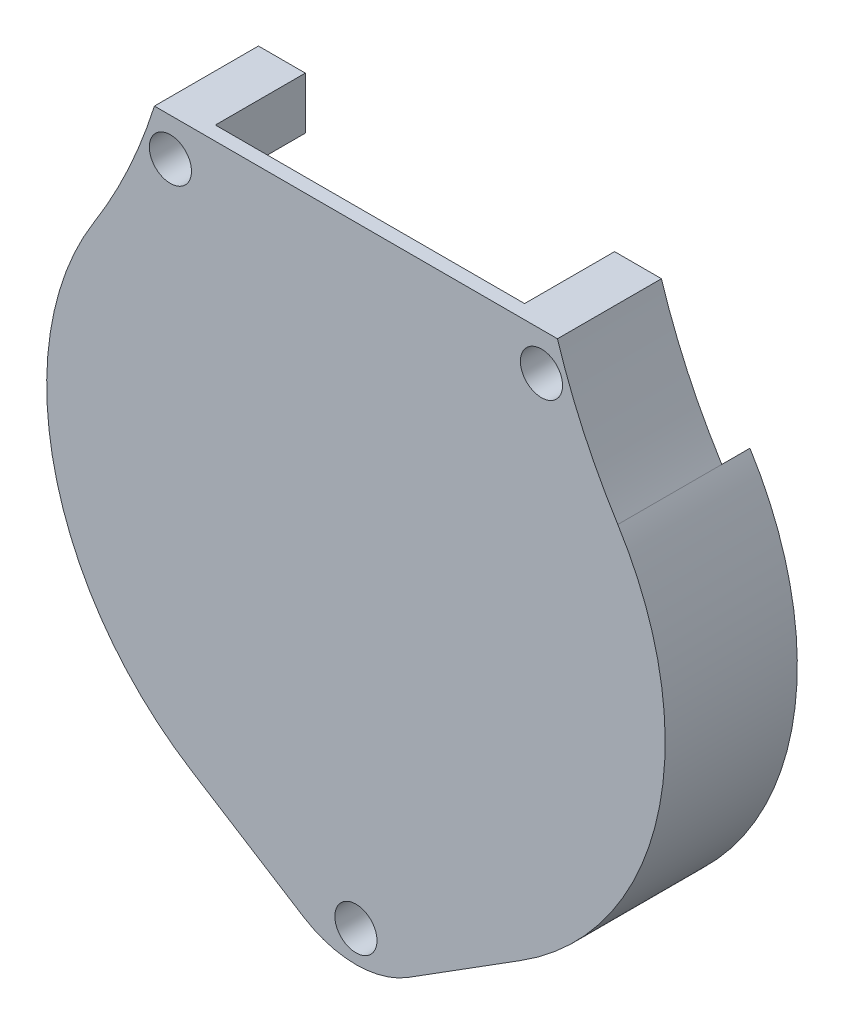
ISO-10303-21;
HEADER;
FILE_DESCRIPTION(('STEP AP214'),'2;1');
FILE_NAME('part.step','',(''),(''),'','','');
FILE_SCHEMA(('AUTOMOTIVE_DESIGN { 1 0 10303 214 1 1 1 1 }'));
ENDSEC;
DATA;
#1=APPLICATION_CONTEXT('core data for automotive mechanical design processes');
#2=APPLICATION_PROTOCOL_DEFINITION('international standard','automotive_design',2000,#1);
#3=PRODUCT_CONTEXT('',#1,'mechanical');
#4=PRODUCT('Part','Part','',(#3));
#5=PRODUCT_RELATED_PRODUCT_CATEGORY('part','',(#4));
#6=PRODUCT_DEFINITION_FORMATION('','',#4);
#7=PRODUCT_DEFINITION_CONTEXT('part definition',#1,'design');
#8=PRODUCT_DEFINITION('design','',#6,#7);
#9=PRODUCT_DEFINITION_SHAPE('','',#8);
#10=(LENGTH_UNIT() NAMED_UNIT(*) SI_UNIT(.MILLI.,.METRE.));
#11=(NAMED_UNIT(*) PLANE_ANGLE_UNIT() SI_UNIT($,.RADIAN.));
#12=(NAMED_UNIT(*) SI_UNIT($,.STERADIAN.) SOLID_ANGLE_UNIT());
#13=UNCERTAINTY_MEASURE_WITH_UNIT(LENGTH_MEASURE(1.E-05),#10,'distance_accuracy_value','');
#14=(GEOMETRIC_REPRESENTATION_CONTEXT(3) GLOBAL_UNCERTAINTY_ASSIGNED_CONTEXT((#13)) GLOBAL_UNIT_ASSIGNED_CONTEXT((#10,
#11,#12)) REPRESENTATION_CONTEXT('',''));
#15=CARTESIAN_POINT('',(0.,0.,0.));
#16=DIRECTION('',(0.,0.,1.));
#17=DIRECTION('',(1.,0.,0.));
#18=AXIS2_PLACEMENT_3D('',#15,#16,#17);
#19=CARTESIAN_POINT('',(0.,-22.5136363636364,0.));
#20=DIRECTION('',(0.,0.,-1.));
#21=DIRECTION('',(-1.,0.,0.));
#22=AXIS2_PLACEMENT_3D('',#19,#20,#21);
#23=PLANE('',#22);
#24=DIRECTION('',(-0.388341695242071,0.921515451707954,0.));
#25=VECTOR('',#24,1.);
#26=CARTESIAN_POINT('',(-23.6588709677419,14.8627529257449,0.));
#27=LINE('',#26,#25);
#28=CARTESIAN_POINT('',(-4.73782513208845,-30.035944055944,0.));
#29=VERTEX_POINT('',#28);
#30=CARTESIAN_POINT('',(-6.80534009565298,-25.1298342848197,0.));
#31=VERTEX_POINT('',#30);
#32=EDGE_CURVE('E189',#29,#31,#27,.T.);
#33=ORIENTED_EDGE('',*,*,#32,.F.);
#34=DIRECTION('',(0.846153846153846,-0.532938710021193,0.));
#35=VECTOR('',#34,1.);
#36=CARTESIAN_POINT('',(-4.73782513208844,-30.035944055944,0.));
#37=LINE('',#36,#35);
#38=CARTESIAN_POINT('',(-14.8903075579921,-23.6415384615385,0.));
#39=VERTEX_POINT('',#38);
#40=EDGE_CURVE('E340',#39,#29,#37,.T.);
#41=ORIENTED_EDGE('',*,*,#40,.F.);
#42=CARTESIAN_POINT('',(0.,0.,0.));
#43=DIRECTION('',(0.,0.,1.));
#44=DIRECTION('',(1.,0.,0.));
#45=AXIS2_PLACEMENT_3D('',#42,#43,#44);
#46=CIRCLE('',#45,27.94);
#47=CARTESIAN_POINT('',(-23.6588709677419,14.8627529257449,0.));
#48=VERTEX_POINT('',#47);
#49=EDGE_CURVE('E356',#48,#39,#46,.T.);
#50=ORIENTED_EDGE('',*,*,#49,.F.);
#51=CARTESIAN_POINT('',(-22.7387926966757,12.6794531308574,0.));
#52=VERTEX_POINT('',#51);
#53=EDGE_CURVE('E253',#52,#48,#27,.T.);
#54=ORIENTED_EDGE('',*,*,#53,.F.);
#55=CARTESIAN_POINT('',(0.,0.,0.));
#56=DIRECTION('',(0.,0.,-1.));
#57=DIRECTION('',(-1.,0.,0.));
#58=AXIS2_PLACEMENT_3D('',#55,#56,#57);
#59=CIRCLE('',#58,26.035);
#60=EDGE_CURVE('E321',#31,#52,#59,.T.);
#61=ORIENTED_EDGE('',*,*,#60,.F.);
#62=EDGE_LOOP('',(#33,#41,#50,#54,#61));
#63=FACE_BOUND('',#62,.T.);
#64=ADVANCED_FACE('F33',(#63),#23,.T.);
#65=CARTESIAN_POINT('',(11.7335904138503,23.241,11.43));
#66=DIRECTION('',(0.,1.,0.));
#67=DIRECTION('',(0.,0.,1.));
#68=AXIS2_PLACEMENT_3D('',#65,#66,#67);
#69=PLANE('',#68);
#70=DIRECTION('',(-1.,0.,0.));
#71=VECTOR('',#70,1.);
#72=CARTESIAN_POINT('',(11.7335904138503,23.241,10.668));
#73=LINE('',#72,#71);
#74=CARTESIAN_POINT('',(11.7335904138503,23.241,10.668));
#75=VERTEX_POINT('',#74);
#76=CARTESIAN_POINT('',(-11.7335904138503,23.241,10.668));
#77=VERTEX_POINT('',#76);
#78=EDGE_CURVE('E217',#75,#77,#73,.T.);
#79=ORIENTED_EDGE('',*,*,#78,.F.);
#80=DIRECTION('',(0.,0.,-1.));
#81=VECTOR('',#80,1.);
#82=CARTESIAN_POINT('',(11.7335904138503,23.241,11.43));
#83=LINE('',#82,#81);
#84=CARTESIAN_POINT('',(11.7335904138503,23.241,11.43));
#85=VERTEX_POINT('',#84);
#86=EDGE_CURVE('E331',#85,#75,#83,.T.);
#87=ORIENTED_EDGE('',*,*,#86,.F.);
#88=DIRECTION('',(1.,0.,0.));
#89=VECTOR('',#88,1.);
#90=CARTESIAN_POINT('',(11.7335904138503,23.241,11.43));
#91=LINE('',#90,#89);
#92=CARTESIAN_POINT('',(-11.7335904138503,23.241,11.43));
#93=VERTEX_POINT('',#92);
#94=EDGE_CURVE('E325',#93,#85,#91,.T.);
#95=ORIENTED_EDGE('',*,*,#94,.F.);
#96=DIRECTION('',(0.,0.,-1.));
#97=VECTOR('',#96,1.);
#98=CARTESIAN_POINT('',(-11.7335904138503,23.241,11.43));
#99=LINE('',#98,#97);
#100=EDGE_CURVE('E328',#93,#77,#99,.T.);
#101=ORIENTED_EDGE('',*,*,#100,.T.);
#102=EDGE_LOOP('',(#79,#87,#95,#101));
#103=FACE_BOUND('',#102,.T.);
#104=ADVANCED_FACE('F418',(#103),#69,.F.);
#105=CARTESIAN_POINT('',(0.,-22.5136363636364,11.938));
#106=DIRECTION('',(0.,0.,-1.));
#107=DIRECTION('',(-1.,0.,0.));
#108=AXIS2_PLACEMENT_3D('',#105,#106,#107);
#109=CYLINDRICAL_SURFACE('',#108,8.89);
#110=DIRECTION('',(0.,0.,-1.));
#111=VECTOR('',#110,1.);
#112=CARTESIAN_POINT('',(-4.73782513208844,-30.035944055944,11.938));
#113=LINE('',#112,#111);
#114=CARTESIAN_POINT('',(-4.73782513208844,-30.035944055944,11.938));
#115=VERTEX_POINT('',#114);
#116=CARTESIAN_POINT('',(-4.73782513208845,-30.035944055944,2.54));
#117=VERTEX_POINT('',#116);
#118=EDGE_CURVE('E353',#115,#117,#113,.T.);
#119=ORIENTED_EDGE('',*,*,#118,.T.);
#120=CARTESIAN_POINT('',(0.,-22.5136363636364,2.54));
#121=DIRECTION('',(0.,0.,-1.));
#122=DIRECTION('',(1.,0.,0.));
#123=AXIS2_PLACEMENT_3D('',#120,#121,#122);
#124=CIRCLE('',#123,8.89);
#125=CARTESIAN_POINT('',(4.73782513208845,-30.035944055944,2.54));
#126=VERTEX_POINT('',#125);
#127=EDGE_CURVE('E177',#126,#117,#124,.T.);
#128=ORIENTED_EDGE('',*,*,#127,.F.);
#129=DIRECTION('',(0.,0.,-1.));
#130=VECTOR('',#129,1.);
#131=CARTESIAN_POINT('',(4.73782513208844,-30.035944055944,11.938));
#132=LINE('',#131,#130);
#133=CARTESIAN_POINT('',(4.73782513208844,-30.035944055944,11.938));
#134=VERTEX_POINT('',#133);
#135=EDGE_CURVE('E209',#134,#126,#132,.T.);
#136=ORIENTED_EDGE('',*,*,#135,.F.);
#137=CARTESIAN_POINT('',(0.,-22.5136363636364,11.938));
#138=DIRECTION('',(0.,0.,1.));
#139=DIRECTION('',(-1.,0.,0.));
#140=AXIS2_PLACEMENT_3D('',#137,#138,#139);
#141=CIRCLE('',#140,8.89);
#142=EDGE_CURVE('E336',#115,#134,#141,.T.);
#143=ORIENTED_EDGE('',*,*,#142,.F.);
#144=EDGE_LOOP('',(#119,#128,#136,#143));
#145=FACE_BOUND('',#144,.T.);
#146=ADVANCED_FACE('F35',(#145),#109,.T.);
#147=CARTESIAN_POINT('',(4.73782513208844,-30.035944055944,11.938));
#148=DIRECTION('',(-0.532938710021193,0.846153846153846,0.));
#149=DIRECTION('',(-0.846153846153846,-0.532938710021193,0.));
#150=AXIS2_PLACEMENT_3D('',#147,#148,#149);
#151=PLANE('',#150);
#152=DIRECTION('',(0.846153846153846,0.532938710021193,0.));
#153=VECTOR('',#152,1.);
#154=CARTESIAN_POINT('',(4.73782513208844,-30.035944055944,0.));
#155=LINE('',#154,#153);
#156=CARTESIAN_POINT('',(4.73782513208845,-30.035944055944,0.));
#157=VERTEX_POINT('',#156);
#158=CARTESIAN_POINT('',(14.8903075579921,-23.6415384615385,0.));
#159=VERTEX_POINT('',#158);
#160=EDGE_CURVE('E250',#157,#159,#155,.T.);
#161=ORIENTED_EDGE('',*,*,#160,.T.);
#162=DIRECTION('',(0.,0.,-1.));
#163=VECTOR('',#162,1.);
#164=CARTESIAN_POINT('',(14.8903075579921,-23.6415384615385,11.938));
#165=LINE('',#164,#163);
#166=CARTESIAN_POINT('',(14.8903075579921,-23.6415384615385,11.938));
#167=VERTEX_POINT('',#166);
#168=EDGE_CURVE('E206',#167,#159,#165,.T.);
#169=ORIENTED_EDGE('',*,*,#168,.F.);
#170=DIRECTION('',(0.846153846153846,0.532938710021193,0.));
#171=VECTOR('',#170,1.);
#172=CARTESIAN_POINT('',(4.73782513208844,-30.035944055944,11.938));
#173=LINE('',#172,#171);
#174=EDGE_CURVE('E339',#134,#167,#173,.T.);
#175=ORIENTED_EDGE('',*,*,#174,.F.);
#176=ORIENTED_EDGE('',*,*,#135,.T.);
#177=DIRECTION('',(0.,0.,-1.));
#178=VECTOR('',#177,1.);
#179=CARTESIAN_POINT('',(4.73782513208845,-30.035944055944,2.54));
#180=LINE('',#179,#178);
#181=EDGE_CURVE('E201',#126,#157,#180,.T.);
#182=ORIENTED_EDGE('',*,*,#181,.T.);
#183=EDGE_LOOP('',(#161,#169,#175,#176,#182));
#184=FACE_BOUND('',#183,.T.);
#185=ADVANCED_FACE('F632',(#184),#151,.F.);
#186=CARTESIAN_POINT('',(0.,0.,11.938));
#187=DIRECTION('',(0.,0.,-1.));
#188=DIRECTION('',(-1.,0.,0.));
#189=AXIS2_PLACEMENT_3D('',#186,#187,#188);
#190=CYLINDRICAL_SURFACE('',#189,27.94);
#191=CARTESIAN_POINT('',(0.,0.,0.));
#192=DIRECTION('',(0.,0.,1.));
#193=DIRECTION('',(-1.,0.,0.));
#194=AXIS2_PLACEMENT_3D('',#191,#192,#193);
#195=CIRCLE('',#194,27.94);
#196=CARTESIAN_POINT('',(23.6588709677419,14.8627529257449,0.));
#197=VERTEX_POINT('',#196);
#198=EDGE_CURVE('E200',#159,#197,#195,.T.);
#199=ORIENTED_EDGE('',*,*,#198,.T.);
#200=DIRECTION('',(0.,0.,-1.));
#201=VECTOR('',#200,1.);
#202=CARTESIAN_POINT('',(23.6588709677419,14.8627529257449,2.54));
#203=LINE('',#202,#201);
#204=CARTESIAN_POINT('',(23.6588709677419,14.8627529257449,2.54));
#205=VERTEX_POINT('',#204);
#206=EDGE_CURVE('E173',#205,#197,#203,.T.);
#207=ORIENTED_EDGE('',*,*,#206,.F.);
#208=DIRECTION('',(0.,0.,-1.));
#209=VECTOR('',#208,1.);
#210=CARTESIAN_POINT('',(23.6588709677419,14.8627529257449,11.938));
#211=LINE('',#210,#209);
#212=CARTESIAN_POINT('',(23.6588709677419,14.8627529257449,11.938));
#213=VERTEX_POINT('',#212);
#214=EDGE_CURVE('E196',#213,#205,#211,.T.);
#215=ORIENTED_EDGE('',*,*,#214,.F.);
#216=CARTESIAN_POINT('',(0.,0.,11.938));
#217=DIRECTION('',(0.,0.,1.));
#218=DIRECTION('',(-1.,0.,0.));
#219=AXIS2_PLACEMENT_3D('',#216,#217,#218);
#220=CIRCLE('',#219,27.94);
#221=EDGE_CURVE('E342',#167,#213,#220,.T.);
#222=ORIENTED_EDGE('',*,*,#221,.F.);
#223=ORIENTED_EDGE('',*,*,#168,.T.);
#224=EDGE_LOOP('',(#199,#207,#215,#222,#223));
#225=FACE_BOUND('',#224,.T.);
#226=ADVANCED_FACE('F194',(#225),#190,.T.);
#227=CARTESIAN_POINT('',(66.675,41.8859400634629,11.938));
#228=DIRECTION('',(0.,0.,-1.));
#229=DIRECTION('',(-1.,0.,0.));
#230=AXIS2_PLACEMENT_3D('',#227,#228,#229);
#231=CYLINDRICAL_SURFACE('',#230,50.8);
#232=ORIENTED_EDGE('',*,*,#214,.T.);
#233=CARTESIAN_POINT('',(66.675,41.8859400634628,2.54));
#234=DIRECTION('',(0.,0.,1.));
#235=DIRECTION('',(1.,0.,0.));
#236=AXIS2_PLACEMENT_3D('',#233,#234,#235);
#237=CIRCLE('',#236,50.8);
#238=CARTESIAN_POINT('',(18.2073286304664,26.67,2.54));
#239=VERTEX_POINT('',#238);
#240=EDGE_CURVE('E181',#239,#205,#237,.T.);
#241=ORIENTED_EDGE('',*,*,#240,.F.);
#242=DIRECTION('',(0.,0.,-1.));
#243=VECTOR('',#242,1.);
#244=CARTESIAN_POINT('',(18.2073286304664,26.67,11.938));
#245=LINE('',#244,#243);
#246=CARTESIAN_POINT('',(18.2073286304664,26.67,11.938));
#247=VERTEX_POINT('',#246);
#248=EDGE_CURVE('E207',#247,#239,#245,.T.);
#249=ORIENTED_EDGE('',*,*,#248,.F.);
#250=CARTESIAN_POINT('',(66.675,41.8859400634629,11.938));
#251=DIRECTION('',(0.,0.,-1.));
#252=DIRECTION('',(1.,0.,0.));
#253=AXIS2_PLACEMENT_3D('',#250,#251,#252);
#254=CIRCLE('',#253,50.8);
#255=EDGE_CURVE('E205',#213,#247,#254,.T.);
#256=ORIENTED_EDGE('',*,*,#255,.F.);
#257=EDGE_LOOP('',(#232,#241,#249,#256));
#258=FACE_BOUND('',#257,.T.);
#259=ADVANCED_FACE('F204',(#258),#231,.F.);
#260=CARTESIAN_POINT('',(-18.2073286304664,26.67,11.938));
#261=DIRECTION('',(0.,-1.,0.));
#262=DIRECTION('',(0.,0.,-1.));
#263=AXIS2_PLACEMENT_3D('',#260,#261,#262);
#264=PLANE('',#263);
#265=ORIENTED_EDGE('',*,*,#248,.T.);
#266=DIRECTION('',(1.,0.,0.));
#267=VECTOR('',#266,1.);
#268=CARTESIAN_POINT('',(18.2073286304664,26.67,2.54));
#269=LINE('',#268,#267);
#270=CARTESIAN_POINT('',(13.97,26.67,2.54));
#271=VERTEX_POINT('',#270);
#272=EDGE_CURVE('E184',#271,#239,#269,.T.);
#273=ORIENTED_EDGE('',*,*,#272,.F.);
#274=DIRECTION('',(0.,0.,1.));
#275=VECTOR('',#274,1.);
#276=CARTESIAN_POINT('',(13.97,26.67,11.938));
#277=LINE('',#276,#275);
#278=CARTESIAN_POINT('',(13.97,26.67,10.668));
#279=VERTEX_POINT('',#278);
#280=EDGE_CURVE('E319',#271,#279,#277,.T.);
#281=ORIENTED_EDGE('',*,*,#280,.T.);
#282=DIRECTION('',(1.,0.,0.));
#283=VECTOR('',#282,1.);
#284=CARTESIAN_POINT('',(-18.2073286304664,26.67,10.668));
#285=LINE('',#284,#283);
#286=CARTESIAN_POINT('',(-13.97,26.67,10.668));
#287=VERTEX_POINT('',#286);
#288=EDGE_CURVE('E313',#287,#279,#285,.T.);
#289=ORIENTED_EDGE('',*,*,#288,.F.);
#290=DIRECTION('',(0.,0.,-1.));
#291=VECTOR('',#290,1.);
#292=CARTESIAN_POINT('',(-13.97,26.67,11.938));
#293=LINE('',#292,#291);
#294=CARTESIAN_POINT('',(-13.97,26.67,2.54));
#295=VERTEX_POINT('',#294);
#296=EDGE_CURVE('E316',#287,#295,#293,.T.);
#297=ORIENTED_EDGE('',*,*,#296,.T.);
#298=CARTESIAN_POINT('',(-18.2073286304664,26.67,2.54));
#299=VERTEX_POINT('',#298);
#300=EDGE_CURVE('E202',#299,#295,#269,.T.);
#301=ORIENTED_EDGE('',*,*,#300,.F.);
#302=DIRECTION('',(0.,0.,-1.));
#303=VECTOR('',#302,1.);
#304=CARTESIAN_POINT('',(-18.2073286304664,26.67,11.938));
#305=LINE('',#304,#303);
#306=CARTESIAN_POINT('',(-18.2073286304664,26.67,11.938));
#307=VERTEX_POINT('',#306);
#308=EDGE_CURVE('E211',#307,#299,#305,.T.);
#309=ORIENTED_EDGE('',*,*,#308,.F.);
#310=DIRECTION('',(-1.,0.,0.));
#311=VECTOR('',#310,1.);
#312=CARTESIAN_POINT('',(-18.2073286304664,26.67,11.938));
#313=LINE('',#312,#311);
#314=EDGE_CURVE('E345',#247,#307,#313,.T.);
#315=ORIENTED_EDGE('',*,*,#314,.F.);
#316=EDGE_LOOP('',(#265,#273,#281,#289,#297,#301,#309,#315));
#317=FACE_BOUND('',#316,.T.);
#318=ADVANCED_FACE('F378',(#317),#264,.F.);
#319=CARTESIAN_POINT('',(-66.675,41.8859400634629,11.938));
#320=DIRECTION('',(0.,0.,-1.));
#321=DIRECTION('',(-1.,0.,0.));
#322=AXIS2_PLACEMENT_3D('',#319,#320,#321);
#323=CYLINDRICAL_SURFACE('',#322,50.8);
#324=ORIENTED_EDGE('',*,*,#308,.T.);
#325=CARTESIAN_POINT('',(-66.675,41.8859400634628,2.54));
#326=DIRECTION('',(0.,0.,1.));
#327=DIRECTION('',(-1.,0.,0.));
#328=AXIS2_PLACEMENT_3D('',#325,#326,#327);
#329=CIRCLE('',#328,50.8);
#330=CARTESIAN_POINT('',(-23.6588709677419,14.8627529257449,2.54));
#331=VERTEX_POINT('',#330);
#332=EDGE_CURVE('E374',#331,#299,#329,.T.);
#333=ORIENTED_EDGE('',*,*,#332,.F.);
#334=DIRECTION('',(0.,0.,-1.));
#335=VECTOR('',#334,1.);
#336=CARTESIAN_POINT('',(-23.6588709677419,14.8627529257449,11.938));
#337=LINE('',#336,#335);
#338=CARTESIAN_POINT('',(-23.6588709677419,14.8627529257449,11.938));
#339=VERTEX_POINT('',#338);
#340=EDGE_CURVE('E365',#339,#331,#337,.T.);
#341=ORIENTED_EDGE('',*,*,#340,.F.);
#342=CARTESIAN_POINT('',(-66.675,41.8859400634629,11.938));
#343=DIRECTION('',(0.,0.,-1.));
#344=DIRECTION('',(-1.,0.,0.));
#345=AXIS2_PLACEMENT_3D('',#342,#343,#344);
#346=CIRCLE('',#345,50.8);
#347=EDGE_CURVE('E347',#307,#339,#346,.T.);
#348=ORIENTED_EDGE('',*,*,#347,.F.);
#349=EDGE_LOOP('',(#324,#333,#341,#348));
#350=FACE_BOUND('',#349,.T.);
#351=ADVANCED_FACE('F372',(#350),#323,.F.);
#352=CARTESIAN_POINT('',(0.,0.,11.938));
#353=DIRECTION('',(0.,0.,-1.));
#354=DIRECTION('',(-1.,0.,0.));
#355=AXIS2_PLACEMENT_3D('',#352,#353,#354);
#356=CYLINDRICAL_SURFACE('',#355,27.94);
#357=ORIENTED_EDGE('',*,*,#49,.T.);
#358=DIRECTION('',(0.,0.,-1.));
#359=VECTOR('',#358,1.);
#360=CARTESIAN_POINT('',(-14.8903075579921,-23.6415384615385,11.938));
#361=LINE('',#360,#359);
#362=CARTESIAN_POINT('',(-14.8903075579921,-23.6415384615385,11.938));
#363=VERTEX_POINT('',#362);
#364=EDGE_CURVE('E362',#363,#39,#361,.T.);
#365=ORIENTED_EDGE('',*,*,#364,.F.);
#366=CARTESIAN_POINT('',(0.,0.,11.938));
#367=DIRECTION('',(0.,0.,1.));
#368=DIRECTION('',(1.,0.,0.));
#369=AXIS2_PLACEMENT_3D('',#366,#367,#368);
#370=CIRCLE('',#369,27.94);
#371=EDGE_CURVE('E349',#339,#363,#370,.T.);
#372=ORIENTED_EDGE('',*,*,#371,.F.);
#373=ORIENTED_EDGE('',*,*,#340,.T.);
#374=DIRECTION('',(0.,0.,-1.));
#375=VECTOR('',#374,1.);
#376=CARTESIAN_POINT('',(-23.6588709677419,14.8627529257449,2.54));
#377=LINE('',#376,#375);
#378=EDGE_CURVE('E228',#331,#48,#377,.T.);
#379=ORIENTED_EDGE('',*,*,#378,.T.);
#380=EDGE_LOOP('',(#357,#365,#372,#373,#379));
#381=FACE_BOUND('',#380,.T.);
#382=ADVANCED_FACE('F394',(#381),#356,.T.);
#383=CARTESIAN_POINT('',(-4.73782513208844,-30.035944055944,11.938));
#384=DIRECTION('',(0.532938710021193,0.846153846153846,0.));
#385=DIRECTION('',(-0.846153846153846,0.532938710021193,0.));
#386=AXIS2_PLACEMENT_3D('',#383,#384,#385);
#387=PLANE('',#386);
#388=ORIENTED_EDGE('',*,*,#40,.T.);
#389=DIRECTION('',(0.,0.,-1.));
#390=VECTOR('',#389,1.);
#391=CARTESIAN_POINT('',(-4.73782513208845,-30.035944055944,2.54));
#392=LINE('',#391,#390);
#393=EDGE_CURVE('E260',#117,#29,#392,.T.);
#394=ORIENTED_EDGE('',*,*,#393,.F.);
#395=ORIENTED_EDGE('',*,*,#118,.F.);
#396=DIRECTION('',(0.846153846153846,-0.532938710021193,0.));
#397=VECTOR('',#396,1.);
#398=CARTESIAN_POINT('',(-4.73782513208844,-30.035944055944,11.938));
#399=LINE('',#398,#397);
#400=EDGE_CURVE('E351',#363,#115,#399,.T.);
#401=ORIENTED_EDGE('',*,*,#400,.F.);
#402=ORIENTED_EDGE('',*,*,#364,.T.);
#403=EDGE_LOOP('',(#388,#394,#395,#401,#402));
#404=FACE_BOUND('',#403,.T.);
#405=ADVANCED_FACE('F402',(#404),#387,.F.);
#406=CARTESIAN_POINT('',(0.,-22.5136363636364,11.938));
#407=DIRECTION('',(0.,0.,-1.));
#408=DIRECTION('',(-1.,0.,0.));
#409=AXIS2_PLACEMENT_3D('',#406,#407,#408);
#410=PLANE('',#409);
#411=CARTESIAN_POINT('',(0.,-28.575,11.938));
#412=DIRECTION('',(0.,0.,1.));
#413=DIRECTION('',(1.,0.,0.));
#414=AXIS2_PLACEMENT_3D('',#411,#412,#413);
#415=CIRCLE('',#414,1.905);
#416=CARTESIAN_POINT('',(1.905,-28.575,11.938));
#417=VERTEX_POINT('',#416);
#418=EDGE_CURVE('E290',#417,#417,#415,.T.);
#419=ORIENTED_EDGE('',*,*,#418,.F.);
#420=EDGE_LOOP('',(#419));
#421=FACE_BOUND('',#420,.T.);
#422=CARTESIAN_POINT('',(-16.764,23.241,11.938));
#423=DIRECTION('',(0.,0.,1.));
#424=DIRECTION('',(1.,0.,0.));
#425=AXIS2_PLACEMENT_3D('',#422,#423,#424);
#426=CIRCLE('',#425,1.905);
#427=CARTESIAN_POINT('',(-14.859,23.241,11.938));
#428=VERTEX_POINT('',#427);
#429=EDGE_CURVE('E296',#428,#428,#426,.T.);
#430=ORIENTED_EDGE('',*,*,#429,.F.);
#431=EDGE_LOOP('',(#430));
#432=FACE_BOUND('',#431,.T.);
#433=CARTESIAN_POINT('',(16.764,23.241,11.938));
#434=DIRECTION('',(0.,0.,1.));
#435=DIRECTION('',(1.,0.,0.));
#436=AXIS2_PLACEMENT_3D('',#433,#434,#435);
#437=CIRCLE('',#436,1.905);
#438=CARTESIAN_POINT('',(18.669,23.241,11.938));
#439=VERTEX_POINT('',#438);
#440=EDGE_CURVE('E279',#439,#439,#437,.T.);
#441=ORIENTED_EDGE('',*,*,#440,.F.);
#442=EDGE_LOOP('',(#441));
#443=FACE_BOUND('',#442,.T.);
#444=ORIENTED_EDGE('',*,*,#142,.T.);
#445=ORIENTED_EDGE('',*,*,#174,.T.);
#446=ORIENTED_EDGE('',*,*,#221,.T.);
#447=ORIENTED_EDGE('',*,*,#255,.T.);
#448=ORIENTED_EDGE('',*,*,#314,.T.);
#449=ORIENTED_EDGE('',*,*,#347,.T.);
#450=ORIENTED_EDGE('',*,*,#371,.T.);
#451=ORIENTED_EDGE('',*,*,#400,.T.);
#452=EDGE_LOOP('',(#444,#445,#446,#447,#448,#449,#450,#451));
#453=FACE_BOUND('',#452,.T.);
#454=ADVANCED_FACE('F406',(#421,#432,#443,#453),#410,.F.);
#455=DIRECTION('',(-0.388341695242071,-0.921515451707954,0.));
#456=VECTOR('',#455,1.);
#457=CARTESIAN_POINT('',(23.6588709677419,14.8627529257449,0.));
#458=LINE('',#457,#456);
#459=CARTESIAN_POINT('',(22.7387926966757,12.6794531308574,0.));
#460=VERTEX_POINT('',#459);
#461=EDGE_CURVE('E251',#197,#460,#458,.T.);
#462=ORIENTED_EDGE('',*,*,#461,.F.);
#463=ORIENTED_EDGE('',*,*,#198,.F.);
#464=ORIENTED_EDGE('',*,*,#160,.F.);
#465=CARTESIAN_POINT('',(6.80534009565298,-25.1298342848197,0.));
#466=VERTEX_POINT('',#465);
#467=EDGE_CURVE('E245',#466,#157,#458,.T.);
#468=ORIENTED_EDGE('',*,*,#467,.F.);
#469=EDGE_CURVE('E239',#460,#466,#59,.T.);
#470=ORIENTED_EDGE('',*,*,#469,.F.);
#471=EDGE_LOOP('',(#462,#463,#464,#468,#470));
#472=FACE_BOUND('',#471,.T.);
#473=ADVANCED_FACE('F249',(#472),#23,.T.);
#474=CARTESIAN_POINT('',(0.,0.,11.43));
#475=DIRECTION('',(0.,0.,-1.));
#476=DIRECTION('',(-1.,0.,0.));
#477=AXIS2_PLACEMENT_3D('',#474,#475,#476);
#478=CYLINDRICAL_SURFACE('',#477,26.035);
#479=CARTESIAN_POINT('',(0.,0.,2.54));
#480=DIRECTION('',(0.,0.,1.));
#481=DIRECTION('',(1.,0.,0.));
#482=AXIS2_PLACEMENT_3D('',#479,#480,#481);
#483=CIRCLE('',#482,26.035);
#484=CARTESIAN_POINT('',(6.80534009565298,-25.1298342848197,2.54));
#485=VERTEX_POINT('',#484);
#486=CARTESIAN_POINT('',(-6.80534009565298,-25.1298342848197,2.54));
#487=VERTEX_POINT('',#486);
#488=EDGE_CURVE('E237',#485,#487,#483,.F.);
#489=ORIENTED_EDGE('',*,*,#488,.T.);
#490=DIRECTION('',(0.,0.,-1.));
#491=VECTOR('',#490,1.);
#492=CARTESIAN_POINT('',(-6.80534009565298,-25.1298342848197,11.43));
#493=LINE('',#492,#491);
#494=EDGE_CURVE('E11',#487,#31,#493,.T.);
#495=ORIENTED_EDGE('',*,*,#494,.T.);
#496=ORIENTED_EDGE('',*,*,#60,.T.);
#497=DIRECTION('',(0.,0.,-1.));
#498=VECTOR('',#497,1.);
#499=CARTESIAN_POINT('',(-22.7387926966757,12.6794531308574,11.43));
#500=LINE('',#499,#498);
#501=CARTESIAN_POINT('',(-22.7387926966757,12.6794531308574,2.54));
#502=VERTEX_POINT('',#501);
#503=EDGE_CURVE('E230',#52,#502,#500,.F.);
#504=ORIENTED_EDGE('',*,*,#503,.T.);
#505=CARTESIAN_POINT('',(-13.97,21.9695317428479,2.54));
#506=VERTEX_POINT('',#505);
#507=EDGE_CURVE('E271',#502,#506,#483,.F.);
#508=ORIENTED_EDGE('',*,*,#507,.T.);
#509=DIRECTION('',(0.,0.,-1.));
#510=VECTOR('',#509,1.);
#511=CARTESIAN_POINT('',(-13.97,21.9695317428479,11.43));
#512=LINE('',#511,#510);
#513=CARTESIAN_POINT('',(-13.97,21.9695317428479,10.668));
#514=VERTEX_POINT('',#513);
#515=EDGE_CURVE('E219',#506,#514,#512,.F.);
#516=ORIENTED_EDGE('',*,*,#515,.T.);
#517=CARTESIAN_POINT('',(0.,0.,10.668));
#518=DIRECTION('',(0.,0.,-1.));
#519=DIRECTION('',(-1.,0.,0.));
#520=AXIS2_PLACEMENT_3D('',#517,#518,#519);
#521=CIRCLE('',#520,26.035);
#522=EDGE_CURVE('E309',#77,#514,#521,.F.);
#523=ORIENTED_EDGE('',*,*,#522,.F.);
#524=ORIENTED_EDGE('',*,*,#100,.F.);
#525=CARTESIAN_POINT('',(0.,0.,11.43));
#526=DIRECTION('',(0.,0.,-1.));
#527=DIRECTION('',(-1.,0.,0.));
#528=AXIS2_PLACEMENT_3D('',#525,#526,#527);
#529=CIRCLE('',#528,26.035);
#530=EDGE_CURVE('E322',#85,#93,#529,.T.);
#531=ORIENTED_EDGE('',*,*,#530,.F.);
#532=ORIENTED_EDGE('',*,*,#86,.T.);
#533=CARTESIAN_POINT('',(13.97,21.9695317428479,10.668));
#534=VERTEX_POINT('',#533);
#535=EDGE_CURVE('E312',#534,#75,#521,.F.);
#536=ORIENTED_EDGE('',*,*,#535,.F.);
#537=DIRECTION('',(0.,0.,-1.));
#538=VECTOR('',#537,1.);
#539=CARTESIAN_POINT('',(13.97,21.9695317428479,11.43));
#540=LINE('',#539,#538);
#541=CARTESIAN_POINT('',(13.97,21.9695317428479,2.54));
#542=VERTEX_POINT('',#541);
#543=EDGE_CURVE('E221',#534,#542,#540,.T.);
#544=ORIENTED_EDGE('',*,*,#543,.T.);
#545=CARTESIAN_POINT('',(22.7387926966757,12.6794531308574,2.54));
#546=VERTEX_POINT('',#545);
#547=EDGE_CURVE('E56',#542,#546,#483,.F.);
#548=ORIENTED_EDGE('',*,*,#547,.T.);
#549=DIRECTION('',(0.,0.,-1.));
#550=VECTOR('',#549,1.);
#551=CARTESIAN_POINT('',(22.7387926966757,12.6794531308574,11.43));
#552=LINE('',#551,#550);
#553=EDGE_CURVE('E176',#546,#460,#552,.T.);
#554=ORIENTED_EDGE('',*,*,#553,.T.);
#555=ORIENTED_EDGE('',*,*,#469,.T.);
#556=DIRECTION('',(0.,0.,-1.));
#557=VECTOR('',#556,1.);
#558=CARTESIAN_POINT('',(6.80534009565298,-25.1298342848197,11.43));
#559=LINE('',#558,#557);
#560=EDGE_CURVE('E41',#466,#485,#559,.F.);
#561=ORIENTED_EDGE('',*,*,#560,.T.);
#562=EDGE_LOOP('',(#489,#495,#496,#504,#508,#516,#523,#524,#531,#532,#536,#544,#548,#554,#555,#561));
#563=FACE_BOUND('',#562,.T.);
#564=ADVANCED_FACE('F236',(#563),#478,.F.);
#565=CARTESIAN_POINT('',(0.,0.,11.43));
#566=DIRECTION('',(0.,0.,-1.));
#567=DIRECTION('',(-1.,0.,0.));
#568=AXIS2_PLACEMENT_3D('',#565,#566,#567);
#569=PLANE('',#568);
#570=ORIENTED_EDGE('',*,*,#530,.T.);
#571=ORIENTED_EDGE('',*,*,#94,.T.);
#572=EDGE_LOOP('',(#570,#571));
#573=FACE_BOUND('',#572,.T.);
#574=ADVANCED_FACE('F432',(#573),#569,.T.);
#575=CARTESIAN_POINT('',(13.97,37.2037492414519,10.668));
#576=DIRECTION('',(1.,0.,0.));
#577=DIRECTION('',(0.,1.,0.));
#578=AXIS2_PLACEMENT_3D('',#575,#576,#577);
#579=PLANE('',#578);
#580=ORIENTED_EDGE('',*,*,#280,.F.);
#581=DIRECTION('',(0.,-1.,0.));
#582=VECTOR('',#581,1.);
#583=CARTESIAN_POINT('',(13.97,37.2037492414519,2.54));
#584=LINE('',#583,#582);
#585=EDGE_CURVE('E274',#271,#542,#584,.T.);
#586=ORIENTED_EDGE('',*,*,#585,.T.);
#587=ORIENTED_EDGE('',*,*,#543,.F.);
#588=DIRECTION('',(0.,-1.,0.));
#589=VECTOR('',#588,1.);
#590=CARTESIAN_POINT('',(13.97,37.2037492414519,10.668));
#591=LINE('',#590,#589);
#592=EDGE_CURVE('E289',#279,#534,#591,.T.);
#593=ORIENTED_EDGE('',*,*,#592,.F.);
#594=EDGE_LOOP('',(#580,#586,#587,#593));
#595=FACE_BOUND('',#594,.T.);
#596=ADVANCED_FACE('F410',(#595),#579,.F.);
#597=CARTESIAN_POINT('',(-13.97,37.2037492414519,10.668));
#598=DIRECTION('',(-1.,0.,0.));
#599=DIRECTION('',(0.,-1.,0.));
#600=AXIS2_PLACEMENT_3D('',#597,#598,#599);
#601=PLANE('',#600);
#602=ORIENTED_EDGE('',*,*,#515,.F.);
#603=DIRECTION('',(0.,1.,0.));
#604=VECTOR('',#603,1.);
#605=CARTESIAN_POINT('',(-13.97,37.2037492414519,2.54));
#606=LINE('',#605,#604);
#607=EDGE_CURVE('E268',#506,#295,#606,.T.);
#608=ORIENTED_EDGE('',*,*,#607,.T.);
#609=ORIENTED_EDGE('',*,*,#296,.F.);
#610=DIRECTION('',(0.,1.,0.));
#611=VECTOR('',#610,1.);
#612=CARTESIAN_POINT('',(-13.97,37.2037492414519,10.668));
#613=LINE('',#612,#611);
#614=EDGE_CURVE('E306',#514,#287,#613,.T.);
#615=ORIENTED_EDGE('',*,*,#614,.F.);
#616=EDGE_LOOP('',(#602,#608,#609,#615));
#617=FACE_BOUND('',#616,.T.);
#618=ADVANCED_FACE('F423',(#617),#601,.F.);
#619=CARTESIAN_POINT('',(0.,0.,10.668));
#620=DIRECTION('',(0.,0.,-1.));
#621=DIRECTION('',(-1.,0.,0.));
#622=AXIS2_PLACEMENT_3D('',#619,#620,#621);
#623=PLANE('',#622);
#624=ORIENTED_EDGE('',*,*,#288,.T.);
#625=ORIENTED_EDGE('',*,*,#592,.T.);
#626=ORIENTED_EDGE('',*,*,#535,.T.);
#627=ORIENTED_EDGE('',*,*,#78,.T.);
#628=ORIENTED_EDGE('',*,*,#522,.T.);
#629=ORIENTED_EDGE('',*,*,#614,.T.);
#630=EDGE_LOOP('',(#624,#625,#626,#627,#628,#629));
#631=FACE_BOUND('',#630,.T.);
#632=ADVANCED_FACE('F413',(#631),#623,.T.);
#633=CARTESIAN_POINT('',(16.764,23.241,3.302));
#634=DIRECTION('',(0.,0.,1.));
#635=DIRECTION('',(1.,0.,0.));
#636=AXIS2_PLACEMENT_3D('',#633,#634,#635);
#637=CYLINDRICAL_SURFACE('',#636,1.905);
#638=CARTESIAN_POINT('',(16.764,23.241,3.302));
#639=DIRECTION('',(0.,0.,1.));
#640=DIRECTION('',(1.,0.,0.));
#641=AXIS2_PLACEMENT_3D('',#638,#639,#640);
#642=CIRCLE('',#641,1.905);
#643=CARTESIAN_POINT('',(18.669,23.241,3.302));
#644=VERTEX_POINT('',#643);
#645=EDGE_CURVE('E299',#644,#644,#642,.T.);
#646=ORIENTED_EDGE('',*,*,#645,.F.);
#647=EDGE_LOOP('',(#646));
#648=FACE_BOUND('',#647,.T.);
#649=ORIENTED_EDGE('',*,*,#440,.T.);
#650=EDGE_LOOP('',(#649));
#651=FACE_BOUND('',#650,.T.);
#652=ADVANCED_FACE('F430',(#648,#651),#637,.F.);
#653=CARTESIAN_POINT('',(16.764,23.241,3.302));
#654=DIRECTION('',(0.,0.,1.));
#655=DIRECTION('',(1.,0.,0.));
#656=AXIS2_PLACEMENT_3D('',#653,#654,#655);
#657=PLANE('',#656);
#658=CARTESIAN_POINT('',(16.764,23.241,3.302));
#659=DIRECTION('',(0.,0.,1.));
#660=DIRECTION('',(1.,0.,0.));
#661=AXIS2_PLACEMENT_3D('',#658,#659,#660);
#662=CIRCLE('',#661,1.143);
#663=CARTESIAN_POINT('',(17.907,23.241,3.302));
#664=VERTEX_POINT('',#663);
#665=EDGE_CURVE('E280',#664,#664,#662,.T.);
#666=ORIENTED_EDGE('',*,*,#665,.F.);
#667=EDGE_LOOP('',(#666));
#668=FACE_BOUND('',#667,.T.);
#669=ORIENTED_EDGE('',*,*,#645,.T.);
#670=EDGE_LOOP('',(#669));
#671=FACE_BOUND('',#670,.T.);
#672=ADVANCED_FACE('F585',(#668,#671),#657,.T.);
#673=CARTESIAN_POINT('',(-16.764,23.241,3.302));
#674=DIRECTION('',(0.,0.,1.));
#675=DIRECTION('',(1.,0.,0.));
#676=AXIS2_PLACEMENT_3D('',#673,#674,#675);
#677=CYLINDRICAL_SURFACE('',#676,1.905);
#678=CARTESIAN_POINT('',(-16.764,23.241,3.302));
#679=DIRECTION('',(0.,0.,1.));
#680=DIRECTION('',(1.,0.,0.));
#681=AXIS2_PLACEMENT_3D('',#678,#679,#680);
#682=CIRCLE('',#681,1.905);
#683=CARTESIAN_POINT('',(-14.859,23.241,3.302));
#684=VERTEX_POINT('',#683);
#685=EDGE_CURVE('E293',#684,#684,#682,.T.);
#686=ORIENTED_EDGE('',*,*,#685,.F.);
#687=EDGE_LOOP('',(#686));
#688=FACE_BOUND('',#687,.T.);
#689=ORIENTED_EDGE('',*,*,#429,.T.);
#690=EDGE_LOOP('',(#689));
#691=FACE_BOUND('',#690,.T.);
#692=ADVANCED_FACE('F581',(#688,#691),#677,.F.);
#693=CARTESIAN_POINT('',(-16.764,23.241,3.302));
#694=DIRECTION('',(0.,0.,1.));
#695=DIRECTION('',(1.,0.,0.));
#696=AXIS2_PLACEMENT_3D('',#693,#694,#695);
#697=PLANE('',#696);
#698=CARTESIAN_POINT('',(-16.764,23.241,3.302));
#699=DIRECTION('',(0.,0.,1.));
#700=DIRECTION('',(1.,0.,0.));
#701=AXIS2_PLACEMENT_3D('',#698,#699,#700);
#702=CIRCLE('',#701,1.143);
#703=CARTESIAN_POINT('',(-15.621,23.241,3.302));
#704=VERTEX_POINT('',#703);
#705=EDGE_CURVE('E276',#704,#704,#702,.T.);
#706=ORIENTED_EDGE('',*,*,#705,.F.);
#707=EDGE_LOOP('',(#706));
#708=FACE_BOUND('',#707,.T.);
#709=ORIENTED_EDGE('',*,*,#685,.T.);
#710=EDGE_LOOP('',(#709));
#711=FACE_BOUND('',#710,.T.);
#712=ADVANCED_FACE('F577',(#708,#711),#697,.T.);
#713=CARTESIAN_POINT('',(0.,-28.575,3.302));
#714=DIRECTION('',(0.,0.,1.));
#715=DIRECTION('',(1.,0.,0.));
#716=AXIS2_PLACEMENT_3D('',#713,#714,#715);
#717=CYLINDRICAL_SURFACE('',#716,1.905);
#718=CARTESIAN_POINT('',(0.,-28.575,3.302));
#719=DIRECTION('',(0.,0.,1.));
#720=DIRECTION('',(1.,0.,0.));
#721=AXIS2_PLACEMENT_3D('',#718,#719,#720);
#722=CIRCLE('',#721,1.905);
#723=CARTESIAN_POINT('',(1.905,-28.575,3.302));
#724=VERTEX_POINT('',#723);
#725=EDGE_CURVE('E286',#724,#724,#722,.T.);
#726=ORIENTED_EDGE('',*,*,#725,.F.);
#727=EDGE_LOOP('',(#726));
#728=FACE_BOUND('',#727,.T.);
#729=ORIENTED_EDGE('',*,*,#418,.T.);
#730=EDGE_LOOP('',(#729));
#731=FACE_BOUND('',#730,.T.);
#732=ADVANCED_FACE('F573',(#728,#731),#717,.F.);
#733=CARTESIAN_POINT('',(0.,-28.575,3.302));
#734=DIRECTION('',(0.,0.,1.));
#735=DIRECTION('',(1.,0.,0.));
#736=AXIS2_PLACEMENT_3D('',#733,#734,#735);
#737=PLANE('',#736);
#738=CARTESIAN_POINT('',(0.,-28.575,3.302));
#739=DIRECTION('',(0.,0.,1.));
#740=DIRECTION('',(1.,0.,0.));
#741=AXIS2_PLACEMENT_3D('',#738,#739,#740);
#742=CIRCLE('',#741,1.143);
#743=CARTESIAN_POINT('',(1.143,-28.575,3.302));
#744=VERTEX_POINT('',#743);
#745=EDGE_CURVE('E283',#744,#744,#742,.T.);
#746=ORIENTED_EDGE('',*,*,#745,.F.);
#747=EDGE_LOOP('',(#746));
#748=FACE_BOUND('',#747,.T.);
#749=ORIENTED_EDGE('',*,*,#725,.T.);
#750=EDGE_LOOP('',(#749));
#751=FACE_BOUND('',#750,.T.);
#752=ADVANCED_FACE('F485',(#748,#751),#737,.T.);
#753=CARTESIAN_POINT('',(0.,-28.575,-18.288));
#754=DIRECTION('',(0.,0.,1.));
#755=DIRECTION('',(1.,0.,0.));
#756=AXIS2_PLACEMENT_3D('',#753,#754,#755);
#757=CYLINDRICAL_SURFACE('',#756,1.143);
#758=CARTESIAN_POINT('',(0.,-28.575,2.54));
#759=DIRECTION('',(0.,0.,1.));
#760=DIRECTION('',(1.,0.,0.));
#761=AXIS2_PLACEMENT_3D('',#758,#759,#760);
#762=CIRCLE('',#761,1.143);
#763=CARTESIAN_POINT('',(1.143,-28.575,2.54));
#764=VERTEX_POINT('',#763);
#765=EDGE_CURVE('E265',#764,#764,#762,.F.);
#766=ORIENTED_EDGE('',*,*,#765,.T.);
#767=EDGE_LOOP('',(#766));
#768=FACE_BOUND('',#767,.T.);
#769=ORIENTED_EDGE('',*,*,#745,.T.);
#770=EDGE_LOOP('',(#769));
#771=FACE_BOUND('',#770,.T.);
#772=ADVANCED_FACE('F479',(#768,#771),#757,.F.);
#773=CARTESIAN_POINT('',(16.764,23.241,-18.288));
#774=DIRECTION('',(0.,0.,1.));
#775=DIRECTION('',(1.,0.,0.));
#776=AXIS2_PLACEMENT_3D('',#773,#774,#775);
#777=CYLINDRICAL_SURFACE('',#776,1.143);
#778=CARTESIAN_POINT('',(16.764,23.241,2.54));
#779=DIRECTION('',(0.,0.,1.));
#780=DIRECTION('',(1.,0.,0.));
#781=AXIS2_PLACEMENT_3D('',#778,#779,#780);
#782=CIRCLE('',#781,1.143);
#783=CARTESIAN_POINT('',(17.907,23.241,2.54));
#784=VERTEX_POINT('',#783);
#785=EDGE_CURVE('E227',#784,#784,#782,.F.);
#786=ORIENTED_EDGE('',*,*,#785,.T.);
#787=EDGE_LOOP('',(#786));
#788=FACE_BOUND('',#787,.T.);
#789=ORIENTED_EDGE('',*,*,#665,.T.);
#790=EDGE_LOOP('',(#789));
#791=FACE_BOUND('',#790,.T.);
#792=ADVANCED_FACE('F484',(#788,#791),#777,.F.);
#793=CARTESIAN_POINT('',(-16.764,23.241,-18.288));
#794=DIRECTION('',(0.,0.,1.));
#795=DIRECTION('',(1.,0.,0.));
#796=AXIS2_PLACEMENT_3D('',#793,#794,#795);
#797=CYLINDRICAL_SURFACE('',#796,1.143);
#798=CARTESIAN_POINT('',(-16.764,23.241,2.54));
#799=DIRECTION('',(0.,0.,1.));
#800=DIRECTION('',(1.,0.,0.));
#801=AXIS2_PLACEMENT_3D('',#798,#799,#800);
#802=CIRCLE('',#801,1.143);
#803=CARTESIAN_POINT('',(-15.621,23.241,2.54));
#804=VERTEX_POINT('',#803);
#805=EDGE_CURVE('E224',#804,#804,#802,.F.);
#806=ORIENTED_EDGE('',*,*,#805,.T.);
#807=EDGE_LOOP('',(#806));
#808=FACE_BOUND('',#807,.T.);
#809=ORIENTED_EDGE('',*,*,#705,.T.);
#810=EDGE_LOOP('',(#809));
#811=FACE_BOUND('',#810,.T.);
#812=ADVANCED_FACE('F497',(#808,#811),#797,.F.);
#813=CARTESIAN_POINT('',(66.675,41.8859400634628,2.54));
#814=DIRECTION('',(0.,0.,1.));
#815=DIRECTION('',(1.,0.,0.));
#816=AXIS2_PLACEMENT_3D('',#813,#814,#815);
#817=PLANE('',#816);
#818=ORIENTED_EDGE('',*,*,#805,.F.);
#819=EDGE_LOOP('',(#818));
#820=FACE_BOUND('',#819,.T.);
#821=DIRECTION('',(-0.388341695242071,0.921515451707954,0.));
#822=VECTOR('',#821,1.);
#823=CARTESIAN_POINT('',(-23.6588709677419,14.8627529257449,2.54));
#824=LINE('',#823,#822);
#825=EDGE_CURVE('E381',#502,#331,#824,.T.);
#826=ORIENTED_EDGE('',*,*,#825,.T.);
#827=ORIENTED_EDGE('',*,*,#332,.T.);
#828=ORIENTED_EDGE('',*,*,#300,.T.);
#829=ORIENTED_EDGE('',*,*,#607,.F.);
#830=ORIENTED_EDGE('',*,*,#507,.F.);
#831=EDGE_LOOP('',(#826,#827,#828,#829,#830));
#832=FACE_BOUND('',#831,.T.);
#833=ADVANCED_FACE('F388',(#820,#832),#817,.F.);
#834=CARTESIAN_POINT('',(-23.6588709677419,14.8627529257449,2.54));
#835=DIRECTION('',(-0.921515451707954,-0.388341695242071,0.));
#836=DIRECTION('',(0.388341695242071,-0.921515451707954,0.));
#837=AXIS2_PLACEMENT_3D('',#834,#835,#836);
#838=PLANE('',#837);
#839=ORIENTED_EDGE('',*,*,#53,.T.);
#840=ORIENTED_EDGE('',*,*,#378,.F.);
#841=ORIENTED_EDGE('',*,*,#825,.F.);
#842=ORIENTED_EDGE('',*,*,#503,.F.);
#843=EDGE_LOOP('',(#839,#840,#841,#842));
#844=FACE_BOUND('',#843,.T.);
#845=ADVANCED_FACE('F390',(#844),#838,.F.);
#846=ORIENTED_EDGE('',*,*,#785,.F.);
#847=EDGE_LOOP('',(#846));
#848=FACE_BOUND('',#847,.T.);
#849=ORIENTED_EDGE('',*,*,#585,.F.);
#850=ORIENTED_EDGE('',*,*,#272,.T.);
#851=ORIENTED_EDGE('',*,*,#240,.T.);
#852=DIRECTION('',(-0.388341695242071,-0.921515451707954,0.));
#853=VECTOR('',#852,1.);
#854=CARTESIAN_POINT('',(23.6588709677419,14.8627529257449,2.54));
#855=LINE('',#854,#853);
#856=EDGE_CURVE('E169',#205,#546,#855,.T.);
#857=ORIENTED_EDGE('',*,*,#856,.T.);
#858=ORIENTED_EDGE('',*,*,#547,.F.);
#859=EDGE_LOOP('',(#849,#850,#851,#857,#858));
#860=FACE_BOUND('',#859,.T.);
#861=ADVANCED_FACE('F182',(#848,#860),#817,.F.);
#862=CARTESIAN_POINT('',(23.6588709677419,14.8627529257449,2.54));
#863=DIRECTION('',(0.921515451707954,-0.388341695242071,0.));
#864=DIRECTION('',(0.388341695242071,0.921515451707954,0.));
#865=AXIS2_PLACEMENT_3D('',#862,#863,#864);
#866=PLANE('',#865);
#867=ORIENTED_EDGE('',*,*,#856,.F.);
#868=ORIENTED_EDGE('',*,*,#206,.T.);
#869=ORIENTED_EDGE('',*,*,#461,.T.);
#870=ORIENTED_EDGE('',*,*,#553,.F.);
#871=EDGE_LOOP('',(#867,#868,#869,#870));
#872=FACE_BOUND('',#871,.T.);
#873=ADVANCED_FACE('F171',(#872),#866,.F.);
#874=EDGE_CURVE('E48',#117,#487,#824,.T.);
#875=ORIENTED_EDGE('',*,*,#874,.F.);
#876=ORIENTED_EDGE('',*,*,#393,.T.);
#877=ORIENTED_EDGE('',*,*,#32,.T.);
#878=ORIENTED_EDGE('',*,*,#494,.F.);
#879=EDGE_LOOP('',(#875,#876,#877,#878));
#880=FACE_BOUND('',#879,.T.);
#881=ADVANCED_FACE('F528',(#880),#838,.F.);
#882=ORIENTED_EDGE('',*,*,#467,.T.);
#883=ORIENTED_EDGE('',*,*,#181,.F.);
#884=EDGE_CURVE('E178',#485,#126,#855,.T.);
#885=ORIENTED_EDGE('',*,*,#884,.F.);
#886=ORIENTED_EDGE('',*,*,#560,.F.);
#887=EDGE_LOOP('',(#882,#883,#885,#886));
#888=FACE_BOUND('',#887,.T.);
#889=ADVANCED_FACE('F243',(#888),#866,.F.);
#890=ORIENTED_EDGE('',*,*,#765,.F.);
#891=EDGE_LOOP('',(#890));
#892=FACE_BOUND('',#891,.T.);
#893=ORIENTED_EDGE('',*,*,#884,.T.);
#894=ORIENTED_EDGE('',*,*,#127,.T.);
#895=ORIENTED_EDGE('',*,*,#874,.T.);
#896=ORIENTED_EDGE('',*,*,#488,.F.);
#897=EDGE_LOOP('',(#893,#894,#895,#896));
#898=FACE_BOUND('',#897,.T.);
#899=ADVANCED_FACE('F519',(#892,#898),#817,.F.);
#900=CLOSED_SHELL('',(#64,#104,#146,#185,#226,#259,#318,#351,#382,#405,#454,#473,#564,#574,#596,
#618,#632,#652,#672,#692,#712,#732,#752,#772,#792,#812,#833,#845,#861,#873,#881,#889,#899));
#901=MANIFOLD_SOLID_BREP('B2',#900);
#902=ADVANCED_BREP_SHAPE_REPRESENTATION('',(#18,#901),#14);
#903=SHAPE_DEFINITION_REPRESENTATION(#9,#902);
ENDSEC;
END-ISO-10303-21;
